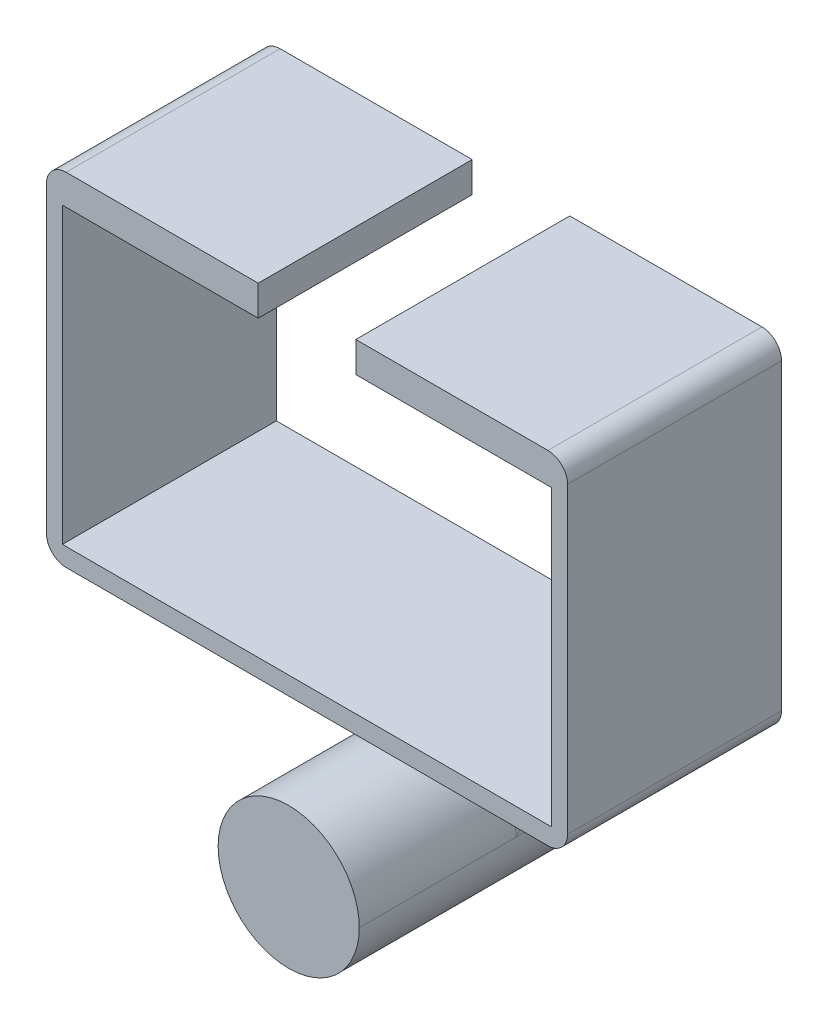
ISO-10303-21;
HEADER;
FILE_DESCRIPTION(('STEP AP214'),'2;1');
FILE_NAME('part.step','',(''),(''),'','','');
FILE_SCHEMA(('AUTOMOTIVE_DESIGN { 1 0 10303 214 1 1 1 1 }'));
ENDSEC;
DATA;
#1=APPLICATION_CONTEXT('core data for automotive mechanical design processes');
#2=APPLICATION_PROTOCOL_DEFINITION('international standard','automotive_design',2000,#1);
#3=PRODUCT_CONTEXT('',#1,'mechanical');
#4=PRODUCT('Part','Part','',(#3));
#5=PRODUCT_RELATED_PRODUCT_CATEGORY('part','',(#4));
#6=PRODUCT_DEFINITION_FORMATION('','',#4);
#7=PRODUCT_DEFINITION_CONTEXT('part definition',#1,'design');
#8=PRODUCT_DEFINITION('design','',#6,#7);
#9=PRODUCT_DEFINITION_SHAPE('','',#8);
#10=(LENGTH_UNIT() NAMED_UNIT(*) SI_UNIT(.MILLI.,.METRE.));
#11=(NAMED_UNIT(*) PLANE_ANGLE_UNIT() SI_UNIT($,.RADIAN.));
#12=(NAMED_UNIT(*) SI_UNIT($,.STERADIAN.) SOLID_ANGLE_UNIT());
#13=UNCERTAINTY_MEASURE_WITH_UNIT(LENGTH_MEASURE(1.E-05),#10,'distance_accuracy_value','');
#14=(GEOMETRIC_REPRESENTATION_CONTEXT(3) GLOBAL_UNCERTAINTY_ASSIGNED_CONTEXT((#13)) GLOBAL_UNIT_ASSIGNED_CONTEXT((#10,
#11,#12)) REPRESENTATION_CONTEXT('',''));
#15=CARTESIAN_POINT('',(0.,0.,0.));
#16=DIRECTION('',(0.,0.,1.));
#17=DIRECTION('',(1.,0.,0.));
#18=AXIS2_PLACEMENT_3D('',#15,#16,#17);
#19=CARTESIAN_POINT('',(0.,-19.05,4.70370370370372));
#20=DIRECTION('',(0.,0.,-1.));
#21=DIRECTION('',(-1.,0.,0.));
#22=AXIS2_PLACEMENT_3D('',#19,#20,#21);
#23=CYLINDRICAL_SURFACE('',#22,9.144);
#24=DIRECTION('',(0.,0.,-1.));
#25=VECTOR('',#24,1.);
#26=CARTESIAN_POINT('',(9.144,-19.05,4.70370370370372));
#27=LINE('',#26,#25);
#28=CARTESIAN_POINT('',(9.144,-19.05,30.1037037037037));
#29=VERTEX_POINT('',#28);
#30=CARTESIAN_POINT('',(9.144,-19.05,9.78370370370372));
#31=VERTEX_POINT('',#30);
#32=EDGE_CURVE('E362',#29,#31,#27,.T.);
#33=ORIENTED_EDGE('',*,*,#32,.F.);
#34=CARTESIAN_POINT('',(0.,-19.05,30.1037037037037));
#35=DIRECTION('',(0.,0.,1.));
#36=DIRECTION('',(1.,0.,0.));
#37=AXIS2_PLACEMENT_3D('',#34,#35,#36);
#38=CIRCLE('',#37,9.144);
#39=CARTESIAN_POINT('',(-9.144,-19.05,30.1037037037037));
#40=VERTEX_POINT('',#39);
#41=EDGE_CURVE('E623',#40,#29,#38,.T.);
#42=ORIENTED_EDGE('',*,*,#41,.F.);
#43=DIRECTION('',(0.,0.,-1.));
#44=VECTOR('',#43,1.);
#45=CARTESIAN_POINT('',(-9.144,-19.05,4.70370370370372));
#46=LINE('',#45,#44);
#47=CARTESIAN_POINT('',(-9.144,-19.05,9.78370370370372));
#48=VERTEX_POINT('',#47);
#49=EDGE_CURVE('E237',#48,#40,#46,.F.);
#50=ORIENTED_EDGE('',*,*,#49,.F.);
#51=DIRECTION('',(0.,0.,-1.));
#52=VECTOR('',#51,1.);
#53=CARTESIAN_POINT('',(-9.144,-19.05,4.70370370370372));
#54=LINE('',#53,#52);
#55=CARTESIAN_POINT('',(-9.144,-19.05,0.));
#56=VERTEX_POINT('',#55);
#57=EDGE_CURVE('E220',#48,#56,#54,.T.);
#58=ORIENTED_EDGE('',*,*,#57,.T.);
#59=CARTESIAN_POINT('',(0.,-19.05,0.));
#60=DIRECTION('',(0.,0.,1.));
#61=DIRECTION('',(1.,0.,0.));
#62=AXIS2_PLACEMENT_3D('',#59,#60,#61);
#63=CIRCLE('',#62,9.144);
#64=CARTESIAN_POINT('',(9.144,-19.05,0.));
#65=VERTEX_POINT('',#64);
#66=EDGE_CURVE('E225',#56,#65,#63,.T.);
#67=ORIENTED_EDGE('',*,*,#66,.T.);
#68=DIRECTION('',(0.,0.,-1.));
#69=VECTOR('',#68,1.);
#70=CARTESIAN_POINT('',(9.144,-19.05,4.70370370370372));
#71=LINE('',#70,#69);
#72=EDGE_CURVE('E240',#31,#65,#71,.T.);
#73=ORIENTED_EDGE('',*,*,#72,.F.);
#74=EDGE_LOOP('',(#33,#42,#50,#58,#67,#73));
#75=FACE_BOUND('',#74,.T.);
#76=ADVANCED_FACE('F49',(#75),#23,.T.);
#77=CARTESIAN_POINT('',(-33.76168,0.,27.7315318518519));
#78=DIRECTION('',(0.,1.,0.));
#79=DIRECTION('',(0.,0.,1.));
#80=AXIS2_PLACEMENT_3D('',#77,#78,#79);
#81=PLANE('',#80);
#82=DIRECTION('',(1.,0.,0.));
#83=VECTOR('',#82,1.);
#84=CARTESIAN_POINT('',(-33.76168,0.,0.));
#85=LINE('',#84,#83);
#86=CARTESIAN_POINT('',(-31.22168,0.,0.));
#87=VERTEX_POINT('',#86);
#88=CARTESIAN_POINT('',(-12.954,0.,0.));
#89=VERTEX_POINT('',#88);
#90=EDGE_CURVE('E294',#87,#89,#85,.T.);
#91=ORIENTED_EDGE('',*,*,#90,.T.);
#92=DIRECTION('',(0.,0.,-1.));
#93=VECTOR('',#92,1.);
#94=CARTESIAN_POINT('',(-12.954,0.,4.70370370370372));
#95=LINE('',#94,#93);
#96=CARTESIAN_POINT('',(-12.954,0.,8.51370370370372));
#97=VERTEX_POINT('',#96);
#98=EDGE_CURVE('E568',#89,#97,#95,.F.);
#99=ORIENTED_EDGE('',*,*,#98,.T.);
#100=DIRECTION('',(-1.,0.,0.));
#101=VECTOR('',#100,1.);
#102=CARTESIAN_POINT('',(-33.76168,0.,8.51370370370372));
#103=LINE('',#102,#101);
#104=CARTESIAN_POINT('',(12.954,0.,8.51370370370372));
#105=VERTEX_POINT('',#104);
#106=EDGE_CURVE('E555',#97,#105,#103,.F.);
#107=ORIENTED_EDGE('',*,*,#106,.T.);
#108=DIRECTION('',(0.,0.,-1.));
#109=VECTOR('',#108,1.);
#110=CARTESIAN_POINT('',(12.954,0.,0.));
#111=LINE('',#110,#109);
#112=CARTESIAN_POINT('',(12.954,0.,0.));
#113=VERTEX_POINT('',#112);
#114=EDGE_CURVE('E561',#105,#113,#111,.T.);
#115=ORIENTED_EDGE('',*,*,#114,.T.);
#116=CARTESIAN_POINT('',(31.22168,0.,0.));
#117=VERTEX_POINT('',#116);
#118=EDGE_CURVE('E246',#113,#117,#85,.T.);
#119=ORIENTED_EDGE('',*,*,#118,.T.);
#120=DIRECTION('',(0.,0.,-1.));
#121=VECTOR('',#120,1.);
#122=CARTESIAN_POINT('',(31.22168,0.,27.7315318518519));
#123=LINE('',#122,#121);
#124=CARTESIAN_POINT('',(31.22168,0.,27.7315318518519));
#125=VERTEX_POINT('',#124);
#126=EDGE_CURVE('E416',#117,#125,#123,.F.);
#127=ORIENTED_EDGE('',*,*,#126,.T.);
#128=DIRECTION('',(1.,0.,0.));
#129=VECTOR('',#128,1.);
#130=CARTESIAN_POINT('',(-33.76168,0.,27.7315318518519));
#131=LINE('',#130,#129);
#132=CARTESIAN_POINT('',(-31.22168,0.,27.7315318518519));
#133=VERTEX_POINT('',#132);
#134=EDGE_CURVE('E256',#133,#125,#131,.T.);
#135=ORIENTED_EDGE('',*,*,#134,.F.);
#136=DIRECTION('',(0.,0.,-1.));
#137=VECTOR('',#136,1.);
#138=CARTESIAN_POINT('',(-31.22168,0.,27.7315318518519));
#139=LINE('',#138,#137);
#140=EDGE_CURVE('E412',#133,#87,#139,.T.);
#141=ORIENTED_EDGE('',*,*,#140,.T.);
#142=EDGE_LOOP('',(#91,#99,#107,#115,#119,#127,#135,#141));
#143=FACE_BOUND('',#142,.T.);
#144=ADVANCED_FACE('F498',(#143),#81,.F.);
#145=CARTESIAN_POINT('',(-33.76168,0.,27.7315318518519));
#146=DIRECTION('',(1.,0.,0.));
#147=DIRECTION('',(0.,1.,0.));
#148=AXIS2_PLACEMENT_3D('',#145,#146,#147);
#149=PLANE('',#148);
#150=DIRECTION('',(0.,-1.,0.));
#151=VECTOR('',#150,1.);
#152=CARTESIAN_POINT('',(-33.76168,0.,27.7315318518519));
#153=LINE('',#152,#151);
#154=CARTESIAN_POINT('',(-33.76168,41.8234518518519,27.7315318518519));
#155=VERTEX_POINT('',#154);
#156=CARTESIAN_POINT('',(-33.76168,2.54,27.7315318518519));
#157=VERTEX_POINT('',#156);
#158=EDGE_CURVE('E252',#155,#157,#153,.T.);
#159=ORIENTED_EDGE('',*,*,#158,.F.);
#160=DIRECTION('',(0.,0.,-1.));
#161=VECTOR('',#160,1.);
#162=CARTESIAN_POINT('',(-33.76168,41.8234518518519,27.7315318518519));
#163=LINE('',#162,#161);
#164=CARTESIAN_POINT('',(-33.76168,41.8234518518519,0.));
#165=VERTEX_POINT('',#164);
#166=EDGE_CURVE('E369',#155,#165,#163,.T.);
#167=ORIENTED_EDGE('',*,*,#166,.T.);
#168=DIRECTION('',(0.,-1.,0.));
#169=VECTOR('',#168,1.);
#170=CARTESIAN_POINT('',(-33.76168,0.,0.));
#171=LINE('',#170,#169);
#172=CARTESIAN_POINT('',(-33.76168,2.54,0.));
#173=VERTEX_POINT('',#172);
#174=EDGE_CURVE('E239',#165,#173,#171,.T.);
#175=ORIENTED_EDGE('',*,*,#174,.T.);
#176=DIRECTION('',(0.,0.,-1.));
#177=VECTOR('',#176,1.);
#178=CARTESIAN_POINT('',(-33.76168,2.54,27.7315318518519));
#179=LINE('',#178,#177);
#180=EDGE_CURVE('E366',#173,#157,#179,.F.);
#181=ORIENTED_EDGE('',*,*,#180,.T.);
#182=EDGE_LOOP('',(#159,#167,#175,#181));
#183=FACE_BOUND('',#182,.T.);
#184=ADVANCED_FACE('F496',(#183),#149,.F.);
#185=CARTESIAN_POINT('',(33.76168,44.3634518518519,27.7315318518519));
#186=DIRECTION('',(-1.,0.,0.));
#187=DIRECTION('',(0.,-1.,0.));
#188=AXIS2_PLACEMENT_3D('',#185,#186,#187);
#189=PLANE('',#188);
#190=DIRECTION('',(0.,1.,0.));
#191=VECTOR('',#190,1.);
#192=CARTESIAN_POINT('',(33.76168,44.3634518518519,0.));
#193=LINE('',#192,#191);
#194=CARTESIAN_POINT('',(33.76168,2.54000000000001,0.));
#195=VERTEX_POINT('',#194);
#196=CARTESIAN_POINT('',(33.76168,41.8234518518519,0.));
#197=VERTEX_POINT('',#196);
#198=EDGE_CURVE('E298',#195,#197,#193,.T.);
#199=ORIENTED_EDGE('',*,*,#198,.T.);
#200=DIRECTION('',(0.,0.,-1.));
#201=VECTOR('',#200,1.);
#202=CARTESIAN_POINT('',(33.76168,41.8234518518519,27.7315318518519));
#203=LINE('',#202,#201);
#204=CARTESIAN_POINT('',(33.76168,41.8234518518519,27.7315318518519));
#205=VERTEX_POINT('',#204);
#206=EDGE_CURVE('E409',#197,#205,#203,.F.);
#207=ORIENTED_EDGE('',*,*,#206,.T.);
#208=DIRECTION('',(0.,1.,0.));
#209=VECTOR('',#208,1.);
#210=CARTESIAN_POINT('',(33.76168,44.3634518518519,27.7315318518519));
#211=LINE('',#210,#209);
#212=CARTESIAN_POINT('',(33.76168,2.54000000000001,27.7315318518519));
#213=VERTEX_POINT('',#212);
#214=EDGE_CURVE('E261',#213,#205,#211,.T.);
#215=ORIENTED_EDGE('',*,*,#214,.F.);
#216=DIRECTION('',(0.,0.,-1.));
#217=VECTOR('',#216,1.);
#218=CARTESIAN_POINT('',(33.76168,2.54000000000001,27.7315318518519));
#219=LINE('',#218,#217);
#220=EDGE_CURVE('E405',#213,#195,#219,.T.);
#221=ORIENTED_EDGE('',*,*,#220,.T.);
#222=EDGE_LOOP('',(#199,#207,#215,#221));
#223=FACE_BOUND('',#222,.T.);
#224=ADVANCED_FACE('F492',(#223),#189,.F.);
#225=CARTESIAN_POINT('',(6.32460000000001,44.3634518518519,27.7315318518519));
#226=DIRECTION('',(0.,-1.,0.));
#227=DIRECTION('',(0.,0.,-1.));
#228=AXIS2_PLACEMENT_3D('',#225,#226,#227);
#229=PLANE('',#228);
#230=DIRECTION('',(-1.,0.,0.));
#231=VECTOR('',#230,1.);
#232=CARTESIAN_POINT('',(6.32460000000001,44.3634518518519,27.7315318518519));
#233=LINE('',#232,#231);
#234=CARTESIAN_POINT('',(31.22168,44.3634518518519,27.7315318518519));
#235=VERTEX_POINT('',#234);
#236=CARTESIAN_POINT('',(6.32460000000001,44.3634518518519,27.7315318518519));
#237=VERTEX_POINT('',#236);
#238=EDGE_CURVE('E265',#235,#237,#233,.T.);
#239=ORIENTED_EDGE('',*,*,#238,.F.);
#240=DIRECTION('',(0.,0.,-1.));
#241=VECTOR('',#240,1.);
#242=CARTESIAN_POINT('',(31.22168,44.3634518518519,27.7315318518519));
#243=LINE('',#242,#241);
#244=CARTESIAN_POINT('',(31.22168,44.3634518518519,0.));
#245=VERTEX_POINT('',#244);
#246=EDGE_CURVE('E401',#235,#245,#243,.T.);
#247=ORIENTED_EDGE('',*,*,#246,.T.);
#248=DIRECTION('',(-1.,0.,0.));
#249=VECTOR('',#248,1.);
#250=CARTESIAN_POINT('',(6.32460000000001,44.3634518518519,0.));
#251=LINE('',#250,#249);
#252=CARTESIAN_POINT('',(6.32460000000001,44.3634518518519,0.));
#253=VERTEX_POINT('',#252);
#254=EDGE_CURVE('E302',#245,#253,#251,.T.);
#255=ORIENTED_EDGE('',*,*,#254,.T.);
#256=DIRECTION('',(0.,0.,-1.));
#257=VECTOR('',#256,1.);
#258=CARTESIAN_POINT('',(6.32460000000001,44.3634518518519,27.7315318518519));
#259=LINE('',#258,#257);
#260=EDGE_CURVE('E356',#237,#253,#259,.T.);
#261=ORIENTED_EDGE('',*,*,#260,.F.);
#262=EDGE_LOOP('',(#239,#247,#255,#261));
#263=FACE_BOUND('',#262,.T.);
#264=ADVANCED_FACE('F488',(#263),#229,.F.);
#265=CARTESIAN_POINT('',(6.32460000000001,40.4264518518519,27.7315318518519));
#266=DIRECTION('',(1.,0.,0.));
#267=DIRECTION('',(0.,0.,-1.));
#268=AXIS2_PLACEMENT_3D('',#265,#266,#267);
#269=PLANE('',#268);
#270=DIRECTION('',(0.,-1.,0.));
#271=VECTOR('',#270,1.);
#272=CARTESIAN_POINT('',(6.32460000000001,40.4264518518519,0.));
#273=LINE('',#272,#271);
#274=CARTESIAN_POINT('',(6.32460000000001,40.4264518518519,0.));
#275=VERTEX_POINT('',#274);
#276=EDGE_CURVE('E305',#253,#275,#273,.T.);
#277=ORIENTED_EDGE('',*,*,#276,.T.);
#278=DIRECTION('',(0.,0.,-1.));
#279=VECTOR('',#278,1.);
#280=CARTESIAN_POINT('',(6.32460000000001,40.4264518518519,27.7315318518519));
#281=LINE('',#280,#279);
#282=CARTESIAN_POINT('',(6.32460000000001,40.4264518518519,27.7315318518519));
#283=VERTEX_POINT('',#282);
#284=EDGE_CURVE('E352',#283,#275,#281,.T.);
#285=ORIENTED_EDGE('',*,*,#284,.F.);
#286=DIRECTION('',(0.,-1.,0.));
#287=VECTOR('',#286,1.);
#288=CARTESIAN_POINT('',(6.32460000000001,40.4264518518519,27.7315318518519));
#289=LINE('',#288,#287);
#290=EDGE_CURVE('E268',#237,#283,#289,.T.);
#291=ORIENTED_EDGE('',*,*,#290,.F.);
#292=ORIENTED_EDGE('',*,*,#260,.T.);
#293=EDGE_LOOP('',(#277,#285,#291,#292));
#294=FACE_BOUND('',#293,.T.);
#295=ADVANCED_FACE('F484',(#294),#269,.F.);
#296=CARTESIAN_POINT('',(31.70428,40.4264518518519,27.7315318518519));
#297=DIRECTION('',(0.,1.,0.));
#298=DIRECTION('',(-1.,0.,0.));
#299=AXIS2_PLACEMENT_3D('',#296,#297,#298);
#300=PLANE('',#299);
#301=DIRECTION('',(1.,0.,0.));
#302=VECTOR('',#301,1.);
#303=CARTESIAN_POINT('',(31.70428,40.4264518518519,0.));
#304=LINE('',#303,#302);
#305=CARTESIAN_POINT('',(31.70428,40.4264518518519,0.));
#306=VERTEX_POINT('',#305);
#307=EDGE_CURVE('E308',#275,#306,#304,.T.);
#308=ORIENTED_EDGE('',*,*,#307,.T.);
#309=DIRECTION('',(0.,0.,-1.));
#310=VECTOR('',#309,1.);
#311=CARTESIAN_POINT('',(31.70428,40.4264518518519,27.7315318518519));
#312=LINE('',#311,#310);
#313=CARTESIAN_POINT('',(31.70428,40.4264518518519,27.7315318518519));
#314=VERTEX_POINT('',#313);
#315=EDGE_CURVE('E348',#314,#306,#312,.T.);
#316=ORIENTED_EDGE('',*,*,#315,.F.);
#317=DIRECTION('',(1.,0.,0.));
#318=VECTOR('',#317,1.);
#319=CARTESIAN_POINT('',(31.70428,40.4264518518519,27.7315318518519));
#320=LINE('',#319,#318);
#321=EDGE_CURVE('E271',#283,#314,#320,.T.);
#322=ORIENTED_EDGE('',*,*,#321,.F.);
#323=ORIENTED_EDGE('',*,*,#284,.T.);
#324=EDGE_LOOP('',(#308,#316,#322,#323));
#325=FACE_BOUND('',#324,.T.);
#326=ADVANCED_FACE('F480',(#325),#300,.F.);
#327=CARTESIAN_POINT('',(31.70428,2.35185185185186,27.7315318518519));
#328=DIRECTION('',(1.,0.,0.));
#329=DIRECTION('',(0.,1.,0.));
#330=AXIS2_PLACEMENT_3D('',#327,#328,#329);
#331=PLANE('',#330);
#332=DIRECTION('',(0.,-1.,0.));
#333=VECTOR('',#332,1.);
#334=CARTESIAN_POINT('',(31.70428,2.35185185185186,0.));
#335=LINE('',#334,#333);
#336=CARTESIAN_POINT('',(31.70428,2.35185185185186,0.));
#337=VERTEX_POINT('',#336);
#338=EDGE_CURVE('E311',#306,#337,#335,.T.);
#339=ORIENTED_EDGE('',*,*,#338,.T.);
#340=DIRECTION('',(0.,0.,-1.));
#341=VECTOR('',#340,1.);
#342=CARTESIAN_POINT('',(31.70428,2.35185185185186,27.7315318518519));
#343=LINE('',#342,#341);
#344=CARTESIAN_POINT('',(31.70428,2.35185185185186,27.7315318518519));
#345=VERTEX_POINT('',#344);
#346=EDGE_CURVE('E344',#345,#337,#343,.T.);
#347=ORIENTED_EDGE('',*,*,#346,.F.);
#348=DIRECTION('',(0.,-1.,0.));
#349=VECTOR('',#348,1.);
#350=CARTESIAN_POINT('',(31.70428,2.35185185185186,27.7315318518519));
#351=LINE('',#350,#349);
#352=EDGE_CURVE('E274',#314,#345,#351,.T.);
#353=ORIENTED_EDGE('',*,*,#352,.F.);
#354=ORIENTED_EDGE('',*,*,#315,.T.);
#355=EDGE_LOOP('',(#339,#347,#353,#354));
#356=FACE_BOUND('',#355,.T.);
#357=ADVANCED_FACE('F476',(#356),#331,.F.);
#358=CARTESIAN_POINT('',(-31.70428,2.35185185185186,27.7315318518519));
#359=DIRECTION('',(0.,-1.,0.));
#360=DIRECTION('',(0.,0.,-1.));
#361=AXIS2_PLACEMENT_3D('',#358,#359,#360);
#362=PLANE('',#361);
#363=DIRECTION('',(-1.,0.,0.));
#364=VECTOR('',#363,1.);
#365=CARTESIAN_POINT('',(-31.70428,2.35185185185186,0.));
#366=LINE('',#365,#364);
#367=CARTESIAN_POINT('',(-31.70428,2.35185185185186,0.));
#368=VERTEX_POINT('',#367);
#369=EDGE_CURVE('E314',#337,#368,#366,.T.);
#370=ORIENTED_EDGE('',*,*,#369,.T.);
#371=DIRECTION('',(0.,0.,-1.));
#372=VECTOR('',#371,1.);
#373=CARTESIAN_POINT('',(-31.70428,2.35185185185186,27.7315318518519));
#374=LINE('',#373,#372);
#375=CARTESIAN_POINT('',(-31.70428,2.35185185185186,27.7315318518519));
#376=VERTEX_POINT('',#375);
#377=EDGE_CURVE('E340',#376,#368,#374,.T.);
#378=ORIENTED_EDGE('',*,*,#377,.F.);
#379=DIRECTION('',(-1.,0.,0.));
#380=VECTOR('',#379,1.);
#381=CARTESIAN_POINT('',(-31.70428,2.35185185185186,27.7315318518519));
#382=LINE('',#381,#380);
#383=EDGE_CURVE('E277',#345,#376,#382,.T.);
#384=ORIENTED_EDGE('',*,*,#383,.F.);
#385=ORIENTED_EDGE('',*,*,#346,.T.);
#386=EDGE_LOOP('',(#370,#378,#384,#385));
#387=FACE_BOUND('',#386,.T.);
#388=ADVANCED_FACE('F472',(#387),#362,.F.);
#389=CARTESIAN_POINT('',(-31.70428,40.4264518518519,27.7315318518519));
#390=DIRECTION('',(-1.,0.,0.));
#391=DIRECTION('',(0.,-1.,0.));
#392=AXIS2_PLACEMENT_3D('',#389,#390,#391);
#393=PLANE('',#392);
#394=DIRECTION('',(0.,1.,0.));
#395=VECTOR('',#394,1.);
#396=CARTESIAN_POINT('',(-31.70428,40.4264518518519,0.));
#397=LINE('',#396,#395);
#398=CARTESIAN_POINT('',(-31.70428,40.4264518518519,0.));
#399=VERTEX_POINT('',#398);
#400=EDGE_CURVE('E317',#368,#399,#397,.T.);
#401=ORIENTED_EDGE('',*,*,#400,.T.);
#402=DIRECTION('',(0.,0.,-1.));
#403=VECTOR('',#402,1.);
#404=CARTESIAN_POINT('',(-31.70428,40.4264518518519,27.7315318518519));
#405=LINE('',#404,#403);
#406=CARTESIAN_POINT('',(-31.70428,40.4264518518519,27.7315318518519));
#407=VERTEX_POINT('',#406);
#408=EDGE_CURVE('E336',#407,#399,#405,.T.);
#409=ORIENTED_EDGE('',*,*,#408,.F.);
#410=DIRECTION('',(0.,1.,0.));
#411=VECTOR('',#410,1.);
#412=CARTESIAN_POINT('',(-31.70428,40.4264518518519,27.7315318518519));
#413=LINE('',#412,#411);
#414=EDGE_CURVE('E280',#376,#407,#413,.T.);
#415=ORIENTED_EDGE('',*,*,#414,.F.);
#416=ORIENTED_EDGE('',*,*,#377,.T.);
#417=EDGE_LOOP('',(#401,#409,#415,#416));
#418=FACE_BOUND('',#417,.T.);
#419=ADVANCED_FACE('F468',(#418),#393,.F.);
#420=CARTESIAN_POINT('',(-6.3246,40.4264518518519,27.7315318518519));
#421=DIRECTION('',(0.,1.,0.));
#422=DIRECTION('',(-1.,0.,0.));
#423=AXIS2_PLACEMENT_3D('',#420,#421,#422);
#424=PLANE('',#423);
#425=DIRECTION('',(1.,0.,0.));
#426=VECTOR('',#425,1.);
#427=CARTESIAN_POINT('',(-6.3246,40.4264518518519,0.));
#428=LINE('',#427,#426);
#429=CARTESIAN_POINT('',(-6.3246,40.4264518518519,0.));
#430=VERTEX_POINT('',#429);
#431=EDGE_CURVE('E320',#399,#430,#428,.T.);
#432=ORIENTED_EDGE('',*,*,#431,.T.);
#433=DIRECTION('',(0.,0.,-1.));
#434=VECTOR('',#433,1.);
#435=CARTESIAN_POINT('',(-6.3246,40.4264518518519,27.7315318518519));
#436=LINE('',#435,#434);
#437=CARTESIAN_POINT('',(-6.3246,40.4264518518519,27.7315318518519));
#438=VERTEX_POINT('',#437);
#439=EDGE_CURVE('E332',#438,#430,#436,.T.);
#440=ORIENTED_EDGE('',*,*,#439,.F.);
#441=DIRECTION('',(1.,0.,0.));
#442=VECTOR('',#441,1.);
#443=CARTESIAN_POINT('',(-6.3246,40.4264518518519,27.7315318518519));
#444=LINE('',#443,#442);
#445=EDGE_CURVE('E283',#407,#438,#444,.T.);
#446=ORIENTED_EDGE('',*,*,#445,.F.);
#447=ORIENTED_EDGE('',*,*,#408,.T.);
#448=EDGE_LOOP('',(#432,#440,#446,#447));
#449=FACE_BOUND('',#448,.T.);
#450=ADVANCED_FACE('F464',(#449),#424,.F.);
#451=CARTESIAN_POINT('',(-6.3246,44.3634518518519,27.7315318518519));
#452=DIRECTION('',(-1.,0.,0.));
#453=DIRECTION('',(0.,-1.,0.));
#454=AXIS2_PLACEMENT_3D('',#451,#452,#453);
#455=PLANE('',#454);
#456=DIRECTION('',(0.,1.,0.));
#457=VECTOR('',#456,1.);
#458=CARTESIAN_POINT('',(-6.3246,44.3634518518519,0.));
#459=LINE('',#458,#457);
#460=CARTESIAN_POINT('',(-6.3246,44.3634518518519,0.));
#461=VERTEX_POINT('',#460);
#462=EDGE_CURVE('E323',#430,#461,#459,.T.);
#463=ORIENTED_EDGE('',*,*,#462,.T.);
#464=DIRECTION('',(0.,0.,-1.));
#465=VECTOR('',#464,1.);
#466=CARTESIAN_POINT('',(-6.3246,44.3634518518519,27.7315318518519));
#467=LINE('',#466,#465);
#468=CARTESIAN_POINT('',(-6.3246,44.3634518518519,27.7315318518519));
#469=VERTEX_POINT('',#468);
#470=EDGE_CURVE('E292',#469,#461,#467,.T.);
#471=ORIENTED_EDGE('',*,*,#470,.F.);
#472=DIRECTION('',(0.,1.,0.));
#473=VECTOR('',#472,1.);
#474=CARTESIAN_POINT('',(-6.3246,44.3634518518519,27.7315318518519));
#475=LINE('',#474,#473);
#476=EDGE_CURVE('E286',#438,#469,#475,.T.);
#477=ORIENTED_EDGE('',*,*,#476,.F.);
#478=ORIENTED_EDGE('',*,*,#439,.T.);
#479=EDGE_LOOP('',(#463,#471,#477,#478));
#480=FACE_BOUND('',#479,.T.);
#481=ADVANCED_FACE('F460',(#480),#455,.F.);
#482=CARTESIAN_POINT('',(-33.76168,44.3634518518519,27.7315318518519));
#483=DIRECTION('',(0.,-1.,0.));
#484=DIRECTION('',(0.,0.,-1.));
#485=AXIS2_PLACEMENT_3D('',#482,#483,#484);
#486=PLANE('',#485);
#487=DIRECTION('',(-1.,0.,0.));
#488=VECTOR('',#487,1.);
#489=CARTESIAN_POINT('',(-33.76168,44.3634518518519,0.));
#490=LINE('',#489,#488);
#491=CARTESIAN_POINT('',(-31.22168,44.3634518518519,0.));
#492=VERTEX_POINT('',#491);
#493=EDGE_CURVE('E257',#461,#492,#490,.T.);
#494=ORIENTED_EDGE('',*,*,#493,.T.);
#495=DIRECTION('',(0.,0.,-1.));
#496=VECTOR('',#495,1.);
#497=CARTESIAN_POINT('',(-31.22168,44.3634518518519,27.7315318518519));
#498=LINE('',#497,#496);
#499=CARTESIAN_POINT('',(-31.22168,44.3634518518519,27.7315318518519));
#500=VERTEX_POINT('',#499);
#501=EDGE_CURVE('E386',#492,#500,#498,.F.);
#502=ORIENTED_EDGE('',*,*,#501,.T.);
#503=DIRECTION('',(-1.,0.,0.));
#504=VECTOR('',#503,1.);
#505=CARTESIAN_POINT('',(-33.76168,44.3634518518519,27.7315318518519));
#506=LINE('',#505,#504);
#507=EDGE_CURVE('E289',#469,#500,#506,.T.);
#508=ORIENTED_EDGE('',*,*,#507,.F.);
#509=ORIENTED_EDGE('',*,*,#470,.T.);
#510=EDGE_LOOP('',(#494,#502,#508,#509));
#511=FACE_BOUND('',#510,.T.);
#512=ADVANCED_FACE('F454',(#511),#486,.F.);
#513=CARTESIAN_POINT('',(0.,0.,27.7315318518519));
#514=DIRECTION('',(0.,0.,-1.));
#515=DIRECTION('',(-1.,0.,0.));
#516=AXIS2_PLACEMENT_3D('',#513,#514,#515);
#517=PLANE('',#516);
#518=ORIENTED_EDGE('',*,*,#507,.T.);
#519=CARTESIAN_POINT('',(-31.22168,41.8234518518519,27.7315318518519));
#520=DIRECTION('',(0.,0.,-1.));
#521=DIRECTION('',(-1.,0.,0.));
#522=AXIS2_PLACEMENT_3D('',#519,#520,#521);
#523=CIRCLE('',#522,2.54);
#524=EDGE_CURVE('E398',#500,#155,#523,.F.);
#525=ORIENTED_EDGE('',*,*,#524,.T.);
#526=ORIENTED_EDGE('',*,*,#158,.T.);
#527=CARTESIAN_POINT('',(-31.22168,2.54,27.7315318518519));
#528=DIRECTION('',(0.,0.,-1.));
#529=DIRECTION('',(-1.,0.,0.));
#530=AXIS2_PLACEMENT_3D('',#527,#528,#529);
#531=CIRCLE('',#530,2.54);
#532=EDGE_CURVE('E389',#157,#133,#531,.F.);
#533=ORIENTED_EDGE('',*,*,#532,.T.);
#534=ORIENTED_EDGE('',*,*,#134,.T.);
#535=CARTESIAN_POINT('',(31.22168,2.54000000000001,27.7315318518519));
#536=DIRECTION('',(0.,0.,-1.));
#537=DIRECTION('',(-1.,0.,0.));
#538=AXIS2_PLACEMENT_3D('',#535,#536,#537);
#539=CIRCLE('',#538,2.54);
#540=EDGE_CURVE('E392',#125,#213,#539,.F.);
#541=ORIENTED_EDGE('',*,*,#540,.T.);
#542=ORIENTED_EDGE('',*,*,#214,.T.);
#543=CARTESIAN_POINT('',(31.22168,41.8234518518519,27.7315318518519));
#544=DIRECTION('',(0.,0.,-1.));
#545=DIRECTION('',(-1.,0.,0.));
#546=AXIS2_PLACEMENT_3D('',#543,#544,#545);
#547=CIRCLE('',#546,2.54);
#548=EDGE_CURVE('E395',#205,#235,#547,.F.);
#549=ORIENTED_EDGE('',*,*,#548,.T.);
#550=ORIENTED_EDGE('',*,*,#238,.T.);
#551=ORIENTED_EDGE('',*,*,#290,.T.);
#552=ORIENTED_EDGE('',*,*,#321,.T.);
#553=ORIENTED_EDGE('',*,*,#352,.T.);
#554=ORIENTED_EDGE('',*,*,#383,.T.);
#555=ORIENTED_EDGE('',*,*,#414,.T.);
#556=ORIENTED_EDGE('',*,*,#445,.T.);
#557=ORIENTED_EDGE('',*,*,#476,.T.);
#558=EDGE_LOOP('',(#518,#525,#526,#533,#534,#541,#542,#549,#550,#551,#552,#553,#554,#555,#556,#557));
#559=FACE_BOUND('',#558,.T.);
#560=ADVANCED_FACE('F451',(#559),#517,.F.);
#561=CARTESIAN_POINT('',(0.,0.,0.));
#562=DIRECTION('',(0.,0.,-1.));
#563=DIRECTION('',(-1.,0.,0.));
#564=AXIS2_PLACEMENT_3D('',#561,#562,#563);
#565=PLANE('',#564);
#566=ORIENTED_EDGE('',*,*,#174,.F.);
#567=CARTESIAN_POINT('',(-31.22168,41.8234518518519,0.));
#568=DIRECTION('',(0.,0.,-1.));
#569=DIRECTION('',(-1.,0.,0.));
#570=AXIS2_PLACEMENT_3D('',#567,#568,#569);
#571=CIRCLE('',#570,2.54);
#572=EDGE_CURVE('E383',#165,#492,#571,.T.);
#573=ORIENTED_EDGE('',*,*,#572,.T.);
#574=ORIENTED_EDGE('',*,*,#493,.F.);
#575=ORIENTED_EDGE('',*,*,#462,.F.);
#576=ORIENTED_EDGE('',*,*,#431,.F.);
#577=ORIENTED_EDGE('',*,*,#400,.F.);
#578=ORIENTED_EDGE('',*,*,#369,.F.);
#579=ORIENTED_EDGE('',*,*,#338,.F.);
#580=ORIENTED_EDGE('',*,*,#307,.F.);
#581=ORIENTED_EDGE('',*,*,#276,.F.);
#582=ORIENTED_EDGE('',*,*,#254,.F.);
#583=CARTESIAN_POINT('',(31.22168,41.8234518518519,0.));
#584=DIRECTION('',(0.,0.,-1.));
#585=DIRECTION('',(-1.,0.,0.));
#586=AXIS2_PLACEMENT_3D('',#583,#584,#585);
#587=CIRCLE('',#586,2.54);
#588=EDGE_CURVE('E380',#245,#197,#587,.T.);
#589=ORIENTED_EDGE('',*,*,#588,.T.);
#590=ORIENTED_EDGE('',*,*,#198,.F.);
#591=CARTESIAN_POINT('',(31.22168,2.54000000000001,0.));
#592=DIRECTION('',(0.,0.,-1.));
#593=DIRECTION('',(-1.,0.,0.));
#594=AXIS2_PLACEMENT_3D('',#591,#592,#593);
#595=CIRCLE('',#594,2.54);
#596=EDGE_CURVE('E376',#195,#117,#595,.T.);
#597=ORIENTED_EDGE('',*,*,#596,.T.);
#598=ORIENTED_EDGE('',*,*,#118,.F.);
#599=CARTESIAN_POINT('',(12.954,-3.81,0.));
#600=DIRECTION('',(0.,0.,-1.));
#601=DIRECTION('',(-1.,0.,0.));
#602=AXIS2_PLACEMENT_3D('',#599,#600,#601);
#603=CIRCLE('',#602,3.81);
#604=CARTESIAN_POINT('',(9.144,-3.81,0.));
#605=VERTEX_POINT('',#604);
#606=EDGE_CURVE('E11',#113,#605,#603,.F.);
#607=ORIENTED_EDGE('',*,*,#606,.T.);
#608=DIRECTION('',(0.,1.,0.));
#609=VECTOR('',#608,1.);
#610=CARTESIAN_POINT('',(9.144,0.,0.));
#611=LINE('',#610,#609);
#612=EDGE_CURVE('E230',#65,#605,#611,.T.);
#613=ORIENTED_EDGE('',*,*,#612,.F.);
#614=ORIENTED_EDGE('',*,*,#66,.F.);
#615=DIRECTION('',(0.,-1.,0.));
#616=VECTOR('',#615,1.);
#617=CARTESIAN_POINT('',(-9.144,0.,0.));
#618=LINE('',#617,#616);
#619=CARTESIAN_POINT('',(-9.144,-3.81,0.));
#620=VERTEX_POINT('',#619);
#621=EDGE_CURVE('E214',#620,#56,#618,.T.);
#622=ORIENTED_EDGE('',*,*,#621,.F.);
#623=CARTESIAN_POINT('',(-12.954,-3.81,0.));
#624=DIRECTION('',(0.,0.,-1.));
#625=DIRECTION('',(-1.,0.,0.));
#626=AXIS2_PLACEMENT_3D('',#623,#624,#625);
#627=CIRCLE('',#626,3.81);
#628=EDGE_CURVE('E59',#620,#89,#627,.F.);
#629=ORIENTED_EDGE('',*,*,#628,.T.);
#630=ORIENTED_EDGE('',*,*,#90,.F.);
#631=CARTESIAN_POINT('',(-31.22168,2.54,0.));
#632=DIRECTION('',(0.,0.,-1.));
#633=DIRECTION('',(-1.,0.,0.));
#634=AXIS2_PLACEMENT_3D('',#631,#632,#633);
#635=CIRCLE('',#634,2.54);
#636=EDGE_CURVE('E373',#87,#173,#635,.T.);
#637=ORIENTED_EDGE('',*,*,#636,.T.);
#638=EDGE_LOOP('',(#566,#573,#574,#575,#576,#577,#578,#579,#580,#581,#582,#589,#590,#597,#598,
#607,#613,#614,#622,#629,#630,#637));
#639=FACE_BOUND('',#638,.T.);
#640=ADVANCED_FACE('F229',(#639),#565,.T.);
#641=CARTESIAN_POINT('',(-9.144,0.,4.70370370370372));
#642=DIRECTION('',(1.,0.,0.));
#643=DIRECTION('',(0.,1.,0.));
#644=AXIS2_PLACEMENT_3D('',#641,#642,#643);
#645=PLANE('',#644);
#646=DIRECTION('',(0.,-1.,0.));
#647=VECTOR('',#646,1.);
#648=CARTESIAN_POINT('',(-9.144,0.,4.70370370370372));
#649=LINE('',#648,#647);
#650=CARTESIAN_POINT('',(-9.144,-3.81,4.70370370370372));
#651=VERTEX_POINT('',#650);
#652=CARTESIAN_POINT('',(-9.144,-8.15461382052017,4.70370370370372));
#653=VERTEX_POINT('',#652);
#654=EDGE_CURVE('E542',#651,#653,#649,.T.);
#655=ORIENTED_EDGE('',*,*,#654,.F.);
#656=DIRECTION('',(0.,0.,-1.));
#657=VECTOR('',#656,1.);
#658=CARTESIAN_POINT('',(-9.144,-3.81,0.));
#659=LINE('',#658,#657);
#660=EDGE_CURVE('E223',#651,#620,#659,.T.);
#661=ORIENTED_EDGE('',*,*,#660,.T.);
#662=ORIENTED_EDGE('',*,*,#621,.T.);
#663=ORIENTED_EDGE('',*,*,#57,.F.);
#664=CARTESIAN_POINT('',(-9.144,-8.15461382052017,4.70370370370372));
#665=CARTESIAN_POINT('',(-9.144,-8.43926539029212,4.70372071101828));
#666=CARTESIAN_POINT('',(-9.144,-8.72358170379272,4.71773484286231));
#667=CARTESIAN_POINT('',(-9.144,-9.28931254155937,4.77099345844214));
#668=CARTESIAN_POINT('',(-9.144,-9.57073168929805,4.81018803695106));
#669=CARTESIAN_POINT('',(-9.144,-10.4009718698967,4.96005525370022));
#670=CARTESIAN_POINT('',(-9.144,-10.9440281565301,5.1031775258114));
#671=CARTESIAN_POINT('',(-9.144,-11.9251721865862,5.42974113276111));
#672=CARTESIAN_POINT('',(-9.144,-12.3666027528016,5.60365648971807));
#673=CARTESIAN_POINT('',(-9.144,-13.2326807320897,5.98953073221307));
#674=CARTESIAN_POINT('',(-9.144,-13.6573175355313,6.20151321294603));
#675=CARTESIAN_POINT('',(-9.144,-14.4936416124377,6.65580630189246));
#676=CARTESIAN_POINT('',(-9.144,-14.9052170911053,6.89831931320963));
#677=CARTESIAN_POINT('',(-9.144,-15.7150270863363,7.40430773554277));
#678=CARTESIAN_POINT('',(-9.144,-16.1132639000441,7.6677795104517));
#679=CARTESIAN_POINT('',(-9.14399999999998,-17.3647518693939,8.52775865565316));
#680=CARTESIAN_POINT('',(-9.1439999999999,-18.1999373478613,9.1501054122488));
#681=CARTESIAN_POINT('',(-9.144,-19.0397773479229,9.77608419391294));
#682=CARTESIAN_POINT('',(-9.144,-19.0448886799524,9.77989395591701));
#683=CARTESIAN_POINT('',(-9.144,-19.05,9.78370370370373));
#684=B_SPLINE_CURVE_WITH_KNOTS('',3,(#664,#665,#666,#667,#668,#669,#670,#671,#672,#673,#674,
#675,#676,#677,#678,#679,#680,#681,#682,#683),.UNSPECIFIED.,.F.,.F.,(4,2,2,2,2,2,2,2,2,4),(0.,
0.853083828688982,1.70448212120983,3.38282743747634,4.80425001817442,6.22655670136754,
7.65884518147572,9.0908857154967,12.2141438218435,12.2332686747841),.UNSPECIFIED.);
#685=EDGE_CURVE('E426',#48,#653,#684,.F.);
#686=ORIENTED_EDGE('',*,*,#685,.T.);
#687=EDGE_LOOP('',(#655,#661,#662,#663,#686));
#688=FACE_BOUND('',#687,.T.);
#689=ADVANCED_FACE('F217',(#688),#645,.F.);
#690=ORIENTED_EDGE('',*,*,#32,.T.);
#691=CARTESIAN_POINT('',(0.,-19.05,9.78370370370373));
#692=DIRECTION('',(0.,0.,1.));
#693=DIRECTION('',(1.,0.,0.));
#694=AXIS2_PLACEMENT_3D('',#691,#692,#693);
#695=CIRCLE('',#694,9.144);
#696=EDGE_CURVE('E419',#31,#48,#695,.T.);
#697=ORIENTED_EDGE('',*,*,#696,.T.);
#698=ORIENTED_EDGE('',*,*,#49,.T.);
#699=EDGE_CURVE('E226',#29,#40,#38,.T.);
#700=ORIENTED_EDGE('',*,*,#699,.F.);
#701=EDGE_LOOP('',(#690,#697,#698,#700));
#702=FACE_BOUND('',#701,.T.);
#703=ADVANCED_FACE('F450',(#702),#23,.T.);
#704=CARTESIAN_POINT('',(9.144,0.,4.70370370370372));
#705=DIRECTION('',(-1.,0.,0.));
#706=DIRECTION('',(0.,-1.,0.));
#707=AXIS2_PLACEMENT_3D('',#704,#705,#706);
#708=PLANE('',#707);
#709=ORIENTED_EDGE('',*,*,#612,.T.);
#710=DIRECTION('',(0.,0.,-1.));
#711=VECTOR('',#710,1.);
#712=CARTESIAN_POINT('',(9.144,-3.81,4.70370370370372));
#713=LINE('',#712,#711);
#714=CARTESIAN_POINT('',(9.144,-3.81,4.70370370370372));
#715=VERTEX_POINT('',#714);
#716=EDGE_CURVE('E72',#605,#715,#713,.F.);
#717=ORIENTED_EDGE('',*,*,#716,.T.);
#718=DIRECTION('',(0.,1.,0.));
#719=VECTOR('',#718,1.);
#720=CARTESIAN_POINT('',(9.144,0.,4.70370370370372));
#721=LINE('',#720,#719);
#722=CARTESIAN_POINT('',(9.144,-8.15461382052017,4.70370370370372));
#723=VERTEX_POINT('',#722);
#724=EDGE_CURVE('E248',#723,#715,#721,.T.);
#725=ORIENTED_EDGE('',*,*,#724,.F.);
#726=CARTESIAN_POINT('',(9.144,-8.15461382052017,4.70370370370372));
#727=CARTESIAN_POINT('',(9.144,-8.43926539029308,4.70372071101828));
#728=CARTESIAN_POINT('',(9.144,-8.72358170379464,4.7177348428624));
#729=CARTESIAN_POINT('',(9.144,-9.28931254156303,4.77099345844257));
#730=CARTESIAN_POINT('',(9.144,-9.57073168930249,4.81018803695172));
#731=CARTESIAN_POINT('',(9.144,-10.4009718699001,4.96005525370113));
#732=CARTESIAN_POINT('',(9.144,-10.9440281565318,5.10317752581199));
#733=CARTESIAN_POINT('',(9.144,-11.9251721865858,5.42974113276092));
#734=CARTESIAN_POINT('',(9.144,-12.3666027528007,5.6036564897176));
#735=CARTESIAN_POINT('',(9.144,-13.2326807320875,5.98953073221218));
#736=CARTESIAN_POINT('',(9.144,-13.6573175355282,6.20151321294498));
#737=CARTESIAN_POINT('',(9.144,-14.4936416124348,6.65580630189022));
#738=CARTESIAN_POINT('',(9.144,-14.9052170911037,6.89831931320645));
#739=CARTESIAN_POINT('',(9.144,-15.7150270863336,7.40430773554323));
#740=CARTESIAN_POINT('',(9.144,-16.1132639000392,7.66777951045677));
#741=CARTESIAN_POINT('',(9.14400000000002,-17.3647518694031,8.52775865564093));
#742=CARTESIAN_POINT('',(9.1440000000001,-18.199937347914,9.15010541217815));
#743=CARTESIAN_POINT('',(9.144,-19.0397773479235,9.77608419391208));
#744=CARTESIAN_POINT('',(9.144,-19.0448886799527,9.77989395591658));
#745=CARTESIAN_POINT('',(9.144,-19.05,9.78370370370373));
#746=B_SPLINE_CURVE_WITH_KNOTS('',3,(#726,#727,#728,#729,#730,#731,#732,#733,#734,#735,#736,
#737,#738,#739,#740,#741,#742,#743,#744,#745),.UNSPECIFIED.,.F.,.F.,(4,2,2,2,2,2,2,2,2,4),(0.,
0.85308382869185,1.70448212121513,3.38282743747635,4.80425001817295,6.22655670136349,
7.6588451814729,9.09088571549672,12.2141438218435,12.2332686747841),.UNSPECIFIED.);
#747=EDGE_CURVE('E435',#723,#31,#746,.T.);
#748=ORIENTED_EDGE('',*,*,#747,.T.);
#749=ORIENTED_EDGE('',*,*,#72,.T.);
#750=EDGE_LOOP('',(#709,#717,#725,#748,#749));
#751=FACE_BOUND('',#750,.T.);
#752=ADVANCED_FACE('F529',(#751),#708,.F.);
#753=CARTESIAN_POINT('',(0.,-19.05,4.70370370370372));
#754=DIRECTION('',(0.,0.,1.));
#755=DIRECTION('',(1.,0.,0.));
#756=AXIS2_PLACEMENT_3D('',#753,#754,#755);
#757=PLANE('',#756);
#758=ORIENTED_EDGE('',*,*,#724,.T.);
#759=DIRECTION('',(-1.,0.,0.));
#760=VECTOR('',#759,1.);
#761=CARTESIAN_POINT('',(0.,-3.81,4.70370370370372));
#762=LINE('',#761,#760);
#763=EDGE_CURVE('E554',#715,#651,#762,.T.);
#764=ORIENTED_EDGE('',*,*,#763,.T.);
#765=ORIENTED_EDGE('',*,*,#654,.T.);
#766=CARTESIAN_POINT('',(0.,-19.05,4.70370370370372));
#767=DIRECTION('',(0.,0.,1.));
#768=DIRECTION('',(1.,0.,0.));
#769=AXIS2_PLACEMENT_3D('',#766,#767,#768);
#770=CIRCLE('',#769,14.224);
#771=EDGE_CURVE('E423',#653,#723,#770,.F.);
#772=ORIENTED_EDGE('',*,*,#771,.T.);
#773=EDGE_LOOP('',(#758,#764,#765,#772));
#774=FACE_BOUND('',#773,.T.);
#775=ADVANCED_FACE('F534',(#774),#757,.T.);
#776=CARTESIAN_POINT('',(0.,-19.05,30.1037037037037));
#777=DIRECTION('',(0.,0.,1.));
#778=DIRECTION('',(1.,0.,0.));
#779=AXIS2_PLACEMENT_3D('',#776,#777,#778);
#780=PLANE('',#779);
#781=ORIENTED_EDGE('',*,*,#699,.T.);
#782=ORIENTED_EDGE('',*,*,#41,.T.);
#783=EDGE_LOOP('',(#781,#782));
#784=FACE_BOUND('',#783,.T.);
#785=ADVANCED_FACE('F509',(#784),#780,.T.);
#786=CARTESIAN_POINT('',(-31.22168,41.8234518518519,27.7315318518519));
#787=DIRECTION('',(0.,0.,-1.));
#788=DIRECTION('',(-1.,0.,0.));
#789=AXIS2_PLACEMENT_3D('',#786,#787,#788);
#790=CYLINDRICAL_SURFACE('',#789,2.54);
#791=ORIENTED_EDGE('',*,*,#524,.F.);
#792=ORIENTED_EDGE('',*,*,#501,.F.);
#793=ORIENTED_EDGE('',*,*,#572,.F.);
#794=ORIENTED_EDGE('',*,*,#166,.F.);
#795=EDGE_LOOP('',(#791,#792,#793,#794));
#796=FACE_BOUND('',#795,.T.);
#797=ADVANCED_FACE('F505',(#796),#790,.T.);
#798=CARTESIAN_POINT('',(31.22168,41.8234518518519,27.7315318518519));
#799=DIRECTION('',(0.,0.,-1.));
#800=DIRECTION('',(-1.,0.,0.));
#801=AXIS2_PLACEMENT_3D('',#798,#799,#800);
#802=CYLINDRICAL_SURFACE('',#801,2.54);
#803=ORIENTED_EDGE('',*,*,#548,.F.);
#804=ORIENTED_EDGE('',*,*,#206,.F.);
#805=ORIENTED_EDGE('',*,*,#588,.F.);
#806=ORIENTED_EDGE('',*,*,#246,.F.);
#807=EDGE_LOOP('',(#803,#804,#805,#806));
#808=FACE_BOUND('',#807,.T.);
#809=ADVANCED_FACE('F508',(#808),#802,.T.);
#810=CARTESIAN_POINT('',(31.22168,2.54000000000001,27.7315318518519));
#811=DIRECTION('',(0.,0.,-1.));
#812=DIRECTION('',(-1.,0.,0.));
#813=AXIS2_PLACEMENT_3D('',#810,#811,#812);
#814=CYLINDRICAL_SURFACE('',#813,2.54);
#815=ORIENTED_EDGE('',*,*,#540,.F.);
#816=ORIENTED_EDGE('',*,*,#126,.F.);
#817=ORIENTED_EDGE('',*,*,#596,.F.);
#818=ORIENTED_EDGE('',*,*,#220,.F.);
#819=EDGE_LOOP('',(#815,#816,#817,#818));
#820=FACE_BOUND('',#819,.T.);
#821=ADVANCED_FACE('F513',(#820),#814,.T.);
#822=CARTESIAN_POINT('',(-31.22168,2.54,27.7315318518519));
#823=DIRECTION('',(0.,0.,-1.));
#824=DIRECTION('',(-1.,0.,0.));
#825=AXIS2_PLACEMENT_3D('',#822,#823,#824);
#826=CYLINDRICAL_SURFACE('',#825,2.54);
#827=ORIENTED_EDGE('',*,*,#532,.F.);
#828=ORIENTED_EDGE('',*,*,#180,.F.);
#829=ORIENTED_EDGE('',*,*,#636,.F.);
#830=ORIENTED_EDGE('',*,*,#140,.F.);
#831=EDGE_LOOP('',(#827,#828,#829,#830));
#832=FACE_BOUND('',#831,.T.);
#833=ADVANCED_FACE('F516',(#832),#826,.T.);
#834=CARTESIAN_POINT('',(0.,-19.05,9.78370370370373));
#835=DIRECTION('',(0.,0.,1.));
#836=DIRECTION('',(1.,0.,0.));
#837=AXIS2_PLACEMENT_3D('',#834,#835,#836);
#838=TOROIDAL_SURFACE('',#837,14.224,5.08);
#839=ORIENTED_EDGE('',*,*,#747,.F.);
#840=ORIENTED_EDGE('',*,*,#771,.F.);
#841=ORIENTED_EDGE('',*,*,#685,.F.);
#842=ORIENTED_EDGE('',*,*,#696,.F.);
#843=EDGE_LOOP('',(#839,#840,#841,#842));
#844=FACE_BOUND('',#843,.T.);
#845=ADVANCED_FACE('F442',(#844),#838,.F.);
#846=CARTESIAN_POINT('',(12.954,-3.81,27.7315318518519));
#847=DIRECTION('',(0.,0.,1.));
#848=DIRECTION('',(1.,0.,0.));
#849=AXIS2_PLACEMENT_3D('',#846,#847,#848);
#850=CYLINDRICAL_SURFACE('',#849,3.81);
#851=ORIENTED_EDGE('',*,*,#606,.F.);
#852=ORIENTED_EDGE('',*,*,#114,.F.);
#853=CARTESIAN_POINT('',(12.954,-3.81,8.51370370370372));
#854=DIRECTION('',(-0.707106781186547,0.,0.707106781186547));
#855=DIRECTION('',(0.707106781186547,0.,0.707106781186547));
#856=AXIS2_PLACEMENT_3D('',#853,#854,#855);
#857=ELLIPSE('',#856,5.38815367264149,3.81);
#858=EDGE_CURVE('E53',#715,#105,#857,.F.);
#859=ORIENTED_EDGE('',*,*,#858,.F.);
#860=ORIENTED_EDGE('',*,*,#716,.F.);
#861=EDGE_LOOP('',(#851,#852,#859,#860));
#862=FACE_BOUND('',#861,.T.);
#863=ADVANCED_FACE('F51',(#862),#850,.F.);
#864=CARTESIAN_POINT('',(0.,-3.81,8.51370370370372));
#865=DIRECTION('',(-1.,0.,0.));
#866=DIRECTION('',(0.,0.,1.));
#867=AXIS2_PLACEMENT_3D('',#864,#865,#866);
#868=CYLINDRICAL_SURFACE('',#867,3.81);
#869=ORIENTED_EDGE('',*,*,#858,.T.);
#870=ORIENTED_EDGE('',*,*,#106,.F.);
#871=CARTESIAN_POINT('',(-12.954,-3.81,8.51370370370372));
#872=DIRECTION('',(-0.707106781186547,0.,-0.707106781186547));
#873=DIRECTION('',(-0.707106781186547,0.,0.707106781186547));
#874=AXIS2_PLACEMENT_3D('',#871,#872,#873);
#875=ELLIPSE('',#874,5.38815367264149,3.81);
#876=EDGE_CURVE('E551',#651,#97,#875,.F.);
#877=ORIENTED_EDGE('',*,*,#876,.F.);
#878=ORIENTED_EDGE('',*,*,#763,.F.);
#879=EDGE_LOOP('',(#869,#870,#877,#878));
#880=FACE_BOUND('',#879,.T.);
#881=ADVANCED_FACE('F553',(#880),#868,.F.);
#882=CARTESIAN_POINT('',(-12.954,-3.81,4.70370370370372));
#883=DIRECTION('',(0.,0.,1.));
#884=DIRECTION('',(1.,0.,0.));
#885=AXIS2_PLACEMENT_3D('',#882,#883,#884);
#886=CYLINDRICAL_SURFACE('',#885,3.81);
#887=ORIENTED_EDGE('',*,*,#876,.T.);
#888=ORIENTED_EDGE('',*,*,#98,.F.);
#889=ORIENTED_EDGE('',*,*,#628,.F.);
#890=ORIENTED_EDGE('',*,*,#660,.F.);
#891=EDGE_LOOP('',(#887,#888,#889,#890));
#892=FACE_BOUND('',#891,.T.);
#893=ADVANCED_FACE('F559',(#892),#886,.F.);
#894=CLOSED_SHELL('',(#76,#144,#184,#224,#264,#295,#326,#357,#388,#419,#450,#481,#512,#560,#640,
#689,#703,#752,#775,#785,#797,#809,#821,#833,#845,#863,#881,#893));
#895=MANIFOLD_SOLID_BREP('B2',#894);
#896=ADVANCED_BREP_SHAPE_REPRESENTATION('',(#18,#895),#14);
#897=SHAPE_DEFINITION_REPRESENTATION(#9,#896);
ENDSEC;
END-ISO-10303-21;
